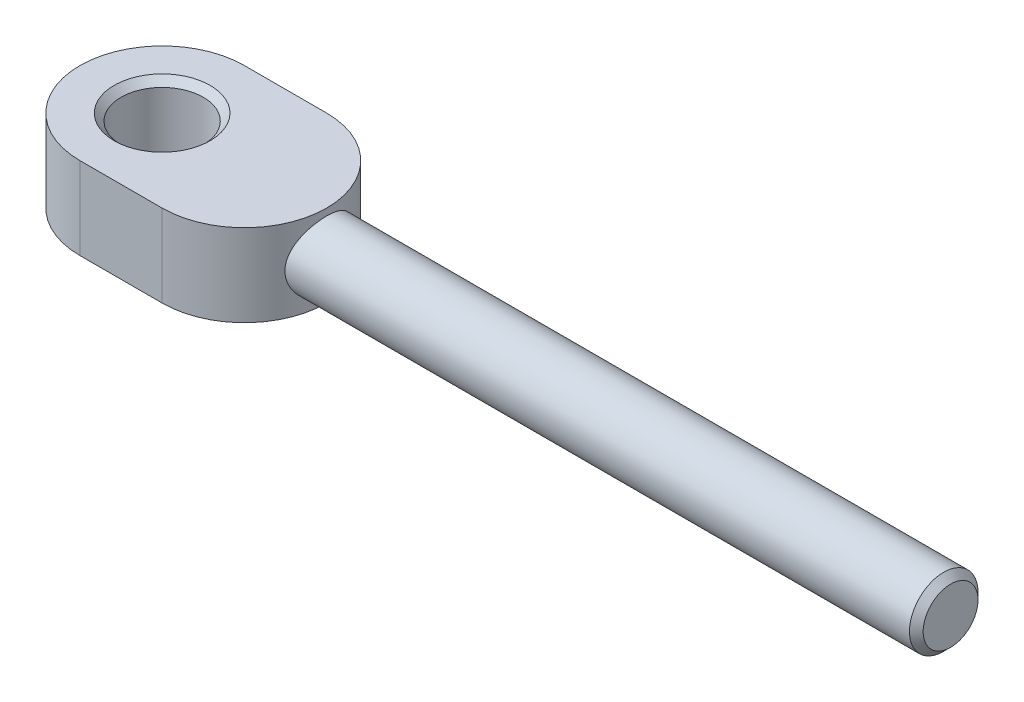
ISO-10303-21;
HEADER;
FILE_DESCRIPTION(('STEP AP214'),'2;1');
FILE_NAME('part.step','',(''),(''),'','','');
FILE_SCHEMA(('AUTOMOTIVE_DESIGN { 1 0 10303 214 1 1 1 1 }'));
ENDSEC;
DATA;
#1=APPLICATION_CONTEXT('core data for automotive mechanical design processes');
#2=APPLICATION_PROTOCOL_DEFINITION('international standard','automotive_design',2000,#1);
#3=PRODUCT_CONTEXT('',#1,'mechanical');
#4=PRODUCT('Part','Part','',(#3));
#5=PRODUCT_RELATED_PRODUCT_CATEGORY('part','',(#4));
#6=PRODUCT_DEFINITION_FORMATION('','',#4);
#7=PRODUCT_DEFINITION_CONTEXT('part definition',#1,'design');
#8=PRODUCT_DEFINITION('design','',#6,#7);
#9=PRODUCT_DEFINITION_SHAPE('','',#8);
#10=(LENGTH_UNIT() NAMED_UNIT(*) SI_UNIT(.MILLI.,.METRE.));
#11=(NAMED_UNIT(*) PLANE_ANGLE_UNIT() SI_UNIT($,.RADIAN.));
#12=(NAMED_UNIT(*) SI_UNIT($,.STERADIAN.) SOLID_ANGLE_UNIT());
#13=UNCERTAINTY_MEASURE_WITH_UNIT(LENGTH_MEASURE(1.E-05),#10,'distance_accuracy_value','');
#14=(GEOMETRIC_REPRESENTATION_CONTEXT(3) GLOBAL_UNCERTAINTY_ASSIGNED_CONTEXT((#13)) GLOBAL_UNIT_ASSIGNED_CONTEXT((#10,
#11,#12)) REPRESENTATION_CONTEXT('',''));
#15=CARTESIAN_POINT('',(0.,0.,0.));
#16=DIRECTION('',(0.,0.,1.));
#17=DIRECTION('',(1.,0.,0.));
#18=AXIS2_PLACEMENT_3D('',#15,#16,#17);
#19=CARTESIAN_POINT('',(0.,12.,0.));
#20=DIRECTION('',(0.,1.,0.));
#21=DIRECTION('',(0.,0.,1.));
#22=AXIS2_PLACEMENT_3D('',#19,#20,#21);
#23=PLANE('',#22);
#24=CARTESIAN_POINT('',(0.,12.,0.));
#25=DIRECTION('',(0.,1.,0.));
#26=DIRECTION('',(0.,0.,1.));
#27=AXIS2_PLACEMENT_3D('',#24,#25,#26);
#28=CIRCLE('',#27,6.99999999999999);
#29=CARTESIAN_POINT('',(0.,12.,6.99999999999999));
#30=VERTEX_POINT('',#29);
#31=EDGE_CURVE('E142',#30,#30,#28,.F.);
#32=ORIENTED_EDGE('',*,*,#31,.T.);
#33=EDGE_LOOP('',(#32));
#34=FACE_BOUND('',#33,.T.);
#35=CARTESIAN_POINT('',(0.,12.,0.));
#36=DIRECTION('',(0.,1.,0.));
#37=DIRECTION('',(0.,0.,1.));
#38=AXIS2_PLACEMENT_3D('',#35,#36,#37);
#39=CIRCLE('',#38,12.);
#40=CARTESIAN_POINT('',(0.,12.,-12.));
#41=VERTEX_POINT('',#40);
#42=CARTESIAN_POINT('',(0.,12.,12.));
#43=VERTEX_POINT('',#42);
#44=EDGE_CURVE('E94',#41,#43,#39,.T.);
#45=ORIENTED_EDGE('',*,*,#44,.T.);
#46=DIRECTION('',(1.,0.,0.));
#47=VECTOR('',#46,1.);
#48=CARTESIAN_POINT('',(0.,12.,12.));
#49=LINE('',#48,#47);
#50=CARTESIAN_POINT('',(12.,12.,12.));
#51=VERTEX_POINT('',#50);
#52=EDGE_CURVE('E90',#43,#51,#49,.T.);
#53=ORIENTED_EDGE('',*,*,#52,.T.);
#54=CARTESIAN_POINT('',(12.,12.,0.));
#55=DIRECTION('',(0.,1.,0.));
#56=DIRECTION('',(0.,0.,1.));
#57=AXIS2_PLACEMENT_3D('',#54,#55,#56);
#58=CIRCLE('',#57,12.);
#59=CARTESIAN_POINT('',(12.,12.,-12.));
#60=VERTEX_POINT('',#59);
#61=EDGE_CURVE('E92',#51,#60,#58,.T.);
#62=ORIENTED_EDGE('',*,*,#61,.T.);
#63=DIRECTION('',(-1.,0.,0.));
#64=VECTOR('',#63,1.);
#65=CARTESIAN_POINT('',(0.,12.,-12.));
#66=LINE('',#65,#64);
#67=EDGE_CURVE('E59',#60,#41,#66,.T.);
#68=ORIENTED_EDGE('',*,*,#67,.T.);
#69=EDGE_LOOP('',(#45,#53,#62,#68));
#70=FACE_BOUND('',#69,.T.);
#71=ADVANCED_FACE('F41',(#34,#70),#23,.T.);
#72=CARTESIAN_POINT('',(0.,0.,0.));
#73=DIRECTION('',(0.,1.,0.));
#74=DIRECTION('',(0.,0.,1.));
#75=AXIS2_PLACEMENT_3D('',#72,#73,#74);
#76=PLANE('',#75);
#77=CARTESIAN_POINT('',(0.,0.,0.));
#78=DIRECTION('',(0.,1.,0.));
#79=DIRECTION('',(0.,0.,1.));
#80=AXIS2_PLACEMENT_3D('',#77,#78,#79);
#81=CIRCLE('',#80,7.);
#82=CARTESIAN_POINT('',(0.,0.,7.));
#83=VERTEX_POINT('',#82);
#84=EDGE_CURVE('E130',#83,#83,#81,.T.);
#85=ORIENTED_EDGE('',*,*,#84,.T.);
#86=EDGE_LOOP('',(#85));
#87=FACE_BOUND('',#86,.T.);
#88=CARTESIAN_POINT('',(0.,0.,0.));
#89=DIRECTION('',(0.,1.,0.));
#90=DIRECTION('',(0.,0.,1.));
#91=AXIS2_PLACEMENT_3D('',#88,#89,#90);
#92=CIRCLE('',#91,12.);
#93=CARTESIAN_POINT('',(0.,0.,-12.));
#94=VERTEX_POINT('',#93);
#95=CARTESIAN_POINT('',(0.,0.,12.));
#96=VERTEX_POINT('',#95);
#97=EDGE_CURVE('E113',#94,#96,#92,.T.);
#98=ORIENTED_EDGE('',*,*,#97,.F.);
#99=DIRECTION('',(-1.,0.,0.));
#100=VECTOR('',#99,1.);
#101=CARTESIAN_POINT('',(0.,0.,-12.));
#102=LINE('',#101,#100);
#103=CARTESIAN_POINT('',(12.,0.,-12.));
#104=VERTEX_POINT('',#103);
#105=EDGE_CURVE('E82',#104,#94,#102,.T.);
#106=ORIENTED_EDGE('',*,*,#105,.F.);
#107=CARTESIAN_POINT('',(12.,0.,0.));
#108=DIRECTION('',(0.,1.,0.));
#109=DIRECTION('',(0.,0.,1.));
#110=AXIS2_PLACEMENT_3D('',#107,#108,#109);
#111=CIRCLE('',#110,12.);
#112=CARTESIAN_POINT('',(12.,0.,12.));
#113=VERTEX_POINT('',#112);
#114=EDGE_CURVE('E76',#113,#104,#111,.T.);
#115=ORIENTED_EDGE('',*,*,#114,.F.);
#116=DIRECTION('',(1.,0.,0.));
#117=VECTOR('',#116,1.);
#118=CARTESIAN_POINT('',(0.,0.,12.));
#119=LINE('',#118,#117);
#120=EDGE_CURVE('E100',#96,#113,#119,.T.);
#121=ORIENTED_EDGE('',*,*,#120,.F.);
#122=EDGE_LOOP('',(#98,#106,#115,#121));
#123=FACE_BOUND('',#122,.T.);
#124=ADVANCED_FACE('F172',(#87,#123),#76,.F.);
#125=CARTESIAN_POINT('',(0.,12.,0.));
#126=DIRECTION('',(0.,-1.,0.));
#127=DIRECTION('',(0.,0.,-1.));
#128=AXIS2_PLACEMENT_3D('',#125,#126,#127);
#129=CYLINDRICAL_SURFACE('',#128,12.);
#130=ORIENTED_EDGE('',*,*,#97,.T.);
#131=DIRECTION('',(0.,-1.,0.));
#132=VECTOR('',#131,1.);
#133=CARTESIAN_POINT('',(0.,12.,12.));
#134=LINE('',#133,#132);
#135=EDGE_CURVE('E102',#43,#96,#134,.T.);
#136=ORIENTED_EDGE('',*,*,#135,.F.);
#137=ORIENTED_EDGE('',*,*,#44,.F.);
#138=DIRECTION('',(0.,-1.,0.));
#139=VECTOR('',#138,1.);
#140=CARTESIAN_POINT('',(0.,12.,-12.));
#141=LINE('',#140,#139);
#142=EDGE_CURVE('E109',#41,#94,#141,.T.);
#143=ORIENTED_EDGE('',*,*,#142,.T.);
#144=EDGE_LOOP('',(#130,#136,#137,#143));
#145=FACE_BOUND('',#144,.T.);
#146=ADVANCED_FACE('F175',(#145),#129,.T.);
#147=CARTESIAN_POINT('',(0.,12.,12.));
#148=DIRECTION('',(0.,0.,-1.));
#149=DIRECTION('',(-1.,0.,0.));
#150=AXIS2_PLACEMENT_3D('',#147,#148,#149);
#151=PLANE('',#150);
#152=ORIENTED_EDGE('',*,*,#120,.T.);
#153=DIRECTION('',(0.,-1.,0.));
#154=VECTOR('',#153,1.);
#155=CARTESIAN_POINT('',(12.,12.,12.));
#156=LINE('',#155,#154);
#157=EDGE_CURVE('E98',#51,#113,#156,.T.);
#158=ORIENTED_EDGE('',*,*,#157,.F.);
#159=ORIENTED_EDGE('',*,*,#52,.F.);
#160=ORIENTED_EDGE('',*,*,#135,.T.);
#161=EDGE_LOOP('',(#152,#158,#159,#160));
#162=FACE_BOUND('',#161,.T.);
#163=ADVANCED_FACE('F99',(#162),#151,.F.);
#164=CARTESIAN_POINT('',(12.,12.,0.));
#165=DIRECTION('',(0.,-1.,0.));
#166=DIRECTION('',(0.,0.,-1.));
#167=AXIS2_PLACEMENT_3D('',#164,#165,#166);
#168=CYLINDRICAL_SURFACE('',#167,12.);
#169=CARTESIAN_POINT('',(22.9087121146357,6.,-5.));
#170=CARTESIAN_POINT('',(22.9087130764532,5.86659865791437,-4.99999907346954));
#171=CARTESIAN_POINT('',(22.9111675954631,5.73314990943804,-4.99465346647854));
#172=CARTESIAN_POINT('',(22.9209052166454,5.46722312061178,-4.97332510133915));
#173=CARTESIAN_POINT('',(22.9281914710262,5.33474577108317,-4.95733539899108));
#174=CARTESIAN_POINT('',(22.94736464011,5.07153052654401,-4.91485001389297));
#175=CARTESIAN_POINT('',(22.9592613290627,4.94079694159147,-4.88833200790255));
#176=CARTESIAN_POINT('',(22.9872633476551,4.68224168103286,-4.82506361967691));
#177=CARTESIAN_POINT('',(23.0033704480092,4.55442125522111,-4.7883089319155));
#178=CARTESIAN_POINT('',(23.0391992954798,4.30314636864751,-4.7051161177753));
#179=CARTESIAN_POINT('',(23.0589043317801,4.17967474799243,-4.65872262741865));
#180=CARTESIAN_POINT('',(23.1013893730745,3.93720574547302,-4.5565572335341));
#181=CARTESIAN_POINT('',(23.1241705351676,3.81821006889575,-4.5007817989946));
#182=CARTESIAN_POINT('',(23.1961478055544,3.46910117112067,-4.32007909456559));
#183=CARTESIAN_POINT('',(23.2490254866249,3.2465492257116,-4.18166963633182));
#184=CARTESIAN_POINT('',(23.3622340846149,2.81466232306502,-3.86388960131915));
#185=CARTESIAN_POINT('',(23.4228172047289,2.60678182765071,-3.68264836841194));
#186=CARTESIAN_POINT('',(23.5425773354484,2.2231870427433,-3.28805127368673));
#187=CARTESIAN_POINT('',(23.6017537962903,2.04748515540236,-3.07468308711391));
#188=CARTESIAN_POINT('',(23.6861172629685,1.80819662209914,-2.72939811902874));
#189=CARTESIAN_POINT('',(23.7140370116577,1.73114749631908,-2.60726265021164));
#190=CARTESIAN_POINT('',(23.7670757792015,1.58768565279853,-2.35633907958865));
#191=CARTESIAN_POINT('',(23.7921959593645,1.52126851970044,-2.22755376893512));
#192=CARTESIAN_POINT('',(23.838917440778,1.39966101478051,-1.96416180919325));
#193=CARTESIAN_POINT('',(23.8605184059307,1.34447171513237,-1.82955460564478));
#194=CARTESIAN_POINT('',(23.8995529267482,1.24590609628429,-1.55556138641083));
#195=CARTESIAN_POINT('',(23.9169885604685,1.20252388509814,-1.41617779348791));
#196=CARTESIAN_POINT('',(23.9463943774625,1.1299506587623,-1.14097065626753));
#197=CARTESIAN_POINT('',(23.9586002649643,1.10014259308929,-1.00533485679253));
#198=CARTESIAN_POINT('',(23.978450915234,1.05189217534323,-0.731783678022631));
#199=CARTESIAN_POINT('',(23.9860977087489,1.03344476279932,-0.593869341827158));
#200=CARTESIAN_POINT('',(23.9966178230295,1.00810936078691,-0.316820356986366));
#201=CARTESIAN_POINT('',(23.9994918028326,1.00121977539495,-0.177685879487621));
#202=CARTESIAN_POINT('',(24.0003846753354,0.999076680636109,0.100685666016497));
#203=CARTESIAN_POINT('',(23.9984037561412,1.0038227204402,0.239922729838139));
#204=CARTESIAN_POINT('',(23.9899136606251,1.0242480185652,0.508875497772577));
#205=CARTESIAN_POINT('',(23.9836886839462,1.03924123047607,0.638652954685693));
#206=CARTESIAN_POINT('',(23.9671679484583,1.07928451587147,0.89642573301948));
#207=CARTESIAN_POINT('',(23.9568708432383,1.10433791570475,1.02442045048903));
#208=CARTESIAN_POINT('',(23.9324642419976,1.16425258678566,1.27768058963447));
#209=CARTESIAN_POINT('',(23.9183560059372,1.19911061677834,1.40294689855866));
#210=CARTESIAN_POINT('',(23.8866740631288,1.27831323073566,1.65000960949552));
#211=CARTESIAN_POINT('',(23.8690990384662,1.32266142297195,1.77180467168387));
#212=CARTESIAN_POINT('',(23.8112061935099,1.47086825690074,2.13440608091059));
#213=CARTESIAN_POINT('',(23.7660875760496,1.58902348292157,2.36878813427704));
#214=CARTESIAN_POINT('',(23.6674248672799,1.85939740044734,2.8148876575074));
#215=CARTESIAN_POINT('',(23.6138778002992,2.01162813038025,3.02659707825227));
#216=CARTESIAN_POINT('',(23.4992708053806,2.35831515830031,3.4373466397403));
#217=CARTESIAN_POINT('',(23.4379473626343,2.55499149580639,3.6344418353681));
#218=CARTESIAN_POINT('',(23.317506835943,2.9788894489507,3.99374958281551));
#219=CARTESIAN_POINT('',(23.2583906106422,3.20612279680368,4.15594867394866));
#220=CARTESIAN_POINT('',(23.1754830102252,3.56976847109777,4.37204843185914));
#221=CARTESIAN_POINT('',(23.1484199498727,3.69704190960107,4.44042007897756));
#222=CARTESIAN_POINT('',(23.0975376088836,3.95754352725252,4.56609824374461));
#223=CARTESIAN_POINT('',(23.0737170007443,4.09076923960836,4.62340929378705));
#224=CARTESIAN_POINT('',(23.0301558587157,4.36223267911825,4.72639308965464));
#225=CARTESIAN_POINT('',(23.010413835582,4.50046855512521,4.77207008493292));
#226=CARTESIAN_POINT('',(22.9757324560172,4.78096035789103,4.85130620649788));
#227=CARTESIAN_POINT('',(22.9607926721103,4.92321592560632,4.88486641140439));
#228=CARTESIAN_POINT('',(22.9370969792104,5.20124231792369,4.93768074905133));
#229=CARTESIAN_POINT('',(22.9280027904062,5.33683517918124,4.95772169190295));
#230=CARTESIAN_POINT('',(22.9148523191373,5.60944791240115,4.9866073793505));
#231=CARTESIAN_POINT('',(22.9107956985943,5.74646768797884,4.99545287528973));
#232=CARTESIAN_POINT('',(22.9078699530068,6.02078605988454,5.00183821697948));
#233=CARTESIAN_POINT('',(22.9089993303948,6.1580845642777,4.9993813265346));
#234=CARTESIAN_POINT('',(22.9163998119757,6.43187112828671,4.98320111894242));
#235=CARTESIAN_POINT('',(22.9226707625354,6.56835921199565,4.96947813843228));
#236=CARTESIAN_POINT('',(22.939564595642,6.83071574253981,4.93217158492222));
#237=CARTESIAN_POINT('',(22.9498816230819,6.95670259071433,4.90927900797924));
#238=CARTESIAN_POINT('',(22.9744912995808,7.20619548163046,4.85401305684628));
#239=CARTESIAN_POINT('',(22.9887852266843,7.32970071315867,4.82163663468421));
#240=CARTESIAN_POINT('',(23.0370194337985,7.69526799217255,4.71071065616066));
#241=CARTESIAN_POINT('',(23.0763259662732,7.93258045461717,4.61833566351839));
#242=CARTESIAN_POINT('',(23.1668340116265,8.3985017812262,4.39509042810499));
#243=CARTESIAN_POINT('',(23.2184687772574,8.62631643122829,4.26275559713322));
#244=CARTESIAN_POINT('',(23.3271978594732,9.05761567004121,3.96481487774639));
#245=CARTESIAN_POINT('',(23.3842945333687,9.26108966760643,3.79919458936811));
#246=CARTESIAN_POINT('',(23.5031524298602,9.65522822272602,3.42333828888212));
#247=CARTESIAN_POINT('',(23.5649149877289,9.84350149729714,3.21056780271632));
#248=CARTESIAN_POINT('',(23.652539724218,10.0973129626824,2.86918502481984));
#249=CARTESIAN_POINT('',(23.6809270167356,10.1771898057794,2.75160882485037));
#250=CARTESIAN_POINT('',(23.7352796462331,10.3268524377314,2.50969002115846));
#251=CARTESIAN_POINT('',(23.761246025341,10.3966425757839,2.38535036573304));
#252=CARTESIAN_POINT('',(23.8101156015739,10.5257499838625,2.13027929692906));
#253=CARTESIAN_POINT('',(23.8330091330538,10.5850343870947,1.99952940315085));
#254=CARTESIAN_POINT('',(23.8749794540163,10.6922886558686,1.73293321082208));
#255=CARTESIAN_POINT('',(23.8940578848995,10.7402633888541,1.59708913398471));
#256=CARTESIAN_POINT('',(23.9278439649912,10.8244116037013,1.32129951276987));
#257=CARTESIAN_POINT('',(23.9425527871688,10.8605882528726,1.18135508018567));
#258=CARTESIAN_POINT('',(23.9671605398288,10.9207404594656,0.898454675987307));
#259=CARTESIAN_POINT('',(23.9770598307871,10.9447169313007,0.755498930910137));
#260=CARTESIAN_POINT('',(23.9912289923392,10.978935158097,0.477883420739099));
#261=CARTESIAN_POINT('',(23.9958449399558,10.9900221403332,0.343344870081025));
#262=CARTESIAN_POINT('',(24.0005316025811,11.0012784342622,0.0736837007935107));
#263=CARTESIAN_POINT('',(24.0006007901938,11.0014440771427,-0.0614390988588049));
#264=CARTESIAN_POINT('',(23.9961887486254,10.9908483610399,-0.33110622953467));
#265=CARTESIAN_POINT('',(23.9917099776235,10.9800929049289,-0.465650833622079));
#266=CARTESIAN_POINT('',(23.9783256851574,10.9477774444591,-0.733261310716006));
#267=CARTESIAN_POINT('',(23.9694185152718,10.9262134167075,-0.866326614198361));
#268=CARTESIAN_POINT('',(23.9478093264375,10.8734696562263,-1.12521434278972));
#269=CARTESIAN_POINT('',(23.9352551439933,10.8426632258164,-1.25112522777306));
#270=CARTESIAN_POINT('',(23.9065633482735,10.7715090739519,-1.49981842973105));
#271=CARTESIAN_POINT('',(23.8904244841412,10.7311580216289,-1.62259963790794));
#272=CARTESIAN_POINT('',(23.8371898373541,10.5963001094981,-1.98503132832704));
#273=CARTESIAN_POINT('',(23.7952573948446,10.4879448731626,-2.21898154506248));
#274=CARTESIAN_POINT('',(23.700229723716,10.2320286177314,-2.67613896894387));
#275=CARTESIAN_POINT('',(23.6467156543532,10.0829170609564,-2.8983828280104));
#276=CARTESIAN_POINT('',(23.5348651891756,9.751985006967,-3.31565850042872));
#277=CARTESIAN_POINT('',(23.4765270075164,9.57015236713049,-3.51068016389786));
#278=CARTESIAN_POINT('',(23.3565857314856,9.16417617105096,-3.88182487095485));
#279=CARTESIAN_POINT('',(23.2950305954797,8.93799545156909,-4.05575892114007));
#280=CARTESIAN_POINT('',(23.2086213285894,8.57814226412511,-4.28644220599616));
#281=CARTESIAN_POINT('',(23.1807840573516,8.45464555962541,-4.3583492231784));
#282=CARTESIAN_POINT('',(23.1279493027585,8.2014884755108,-4.49153302890032));
#283=CARTESIAN_POINT('',(23.1029505274209,8.07183093851671,-4.5528146604858));
#284=CARTESIAN_POINT('',(23.0567342904296,7.80781229372493,-4.66392927630358));
#285=CARTESIAN_POINT('',(23.0354990935144,7.67347702103786,-4.7138162956702));
#286=CARTESIAN_POINT('',(22.9974167298328,7.40050731303406,-4.80199267289388));
#287=CARTESIAN_POINT('',(22.9805674126509,7.2618750220188,-4.84028771585243));
#288=CARTESIAN_POINT('',(22.9519122752477,6.98170813607974,-4.90477948429217));
#289=CARTESIAN_POINT('',(22.9400931451405,6.84018225203986,-4.93100815251904));
#290=CARTESIAN_POINT('',(22.9219030893155,6.55512394637969,-4.9711694184283));
#291=CARTESIAN_POINT('',(22.9155279262954,6.41159317386851,-4.98511157956285));
#292=CARTESIAN_POINT('',(22.9109028487845,6.2231481561255,-4.99521783051923));
#293=CARTESIAN_POINT('',(22.9100818615663,6.17854324168516,-4.99701063605637));
#294=CARTESIAN_POINT('',(22.9089863310182,6.08929398863914,-4.99940188134453));
#295=CARTESIAN_POINT('',(22.9087117927138,6.04464964967469,-5.00000031011128));
#296=CARTESIAN_POINT('',(22.9087121146357,6.,-5.));
#297=B_SPLINE_CURVE_WITH_KNOTS('',3,(#169,#170,#171,#172,#173,#174,#175,#176,#177,#178,#179,
#180,#181,#182,#183,#184,#185,#186,#187,#188,#189,#190,#191,#192,#193,#194,#195,#196,#197,#198,
#199,#200,#201,#202,#203,#204,#205,#206,#207,#208,#209,#210,#211,#212,#213,#214,#215,#216,#217,
#218,#219,#220,#221,#222,#223,#224,#225,#226,#227,#228,#229,#230,#231,#232,#233,#234,#235,#236,
#237,#238,#239,#240,#241,#242,#243,#244,#245,#246,#247,#248,#249,#250,#251,#252,#253,#254,#255,
#256,#257,#258,#259,#260,#261,#262,#263,#264,#265,#266,#267,#268,#269,#270,#271,#272,#273,#274,
#275,#276,#277,#278,#279,#280,#281,#282,#283,#284,#285,#286,#287,#288,#289,#290,#291,#292,#293,
#294,#295,#296),.UNSPECIFIED.,.T.,.F.,(4,2,2,2,2,2,2,2,2,2,2,2,2,2,2,2,2,2,2,2,2,2,2,2,2,2,2,2,
2,2,2,2,2,2,2,2,2,2,2,2,2,2,2,2,2,2,2,2,2,2,2,2,2,2,2,2,2,2,2,2,2,2,2,4),(0.,0.400157436000171,
0.800576190593219,1.201848529411,1.60328989804515,2.00291210380929,2.40268505027807,
3.20123019587003,4.04483609889578,4.88876646006605,5.32954710296567,5.77014421661471,
6.2107833842476,6.6512022587805,7.0688822540997,7.48637606389429,7.90381222072139,
8.32123220399826,8.71313663078892,9.10517074557807,9.49707541213125,9.88912935105431,
10.6843842085816,11.4799204638783,12.3315328967583,13.1834732406336,13.6239634696043,
14.064272810136,14.5044210919574,14.9445301827247,15.3560893757574,15.7676209469674,
16.1790336871391,16.5904341345125,16.9753736617613,17.3604370390525,18.129966872946,
18.9320860691316,19.7345530282234,20.6023475058253,21.0367677320598,21.4710000820441,
21.9065678086378,22.3419477324182,22.7772106778488,23.2124409951531,23.6171514188591,
24.0219977964934,24.4266254703975,24.8314038752673,25.2216396203095,25.6120117507033,
26.3921129345308,27.2074696624053,28.0231295912,28.8942922255873,29.3306260081945,
29.7667603842384,30.2007814897643,30.6345893903394,31.0672421881929,31.4995579237516,
31.6334900472163,31.7674234024044),.UNSPECIFIED.);
#298=CARTESIAN_POINT('',(22.9087121146357,6.,-5.));
#299=VERTEX_POINT('',#298);
#300=EDGE_CURVE('E117',#299,#299,#297,.T.);
#301=ORIENTED_EDGE('',*,*,#300,.T.);
#302=EDGE_LOOP('',(#301));
#303=FACE_BOUND('',#302,.T.);
#304=ORIENTED_EDGE('',*,*,#114,.T.);
#305=DIRECTION('',(0.,-1.,0.));
#306=VECTOR('',#305,1.);
#307=CARTESIAN_POINT('',(12.,12.,-12.));
#308=LINE('',#307,#306);
#309=EDGE_CURVE('E103',#60,#104,#308,.T.);
#310=ORIENTED_EDGE('',*,*,#309,.F.);
#311=ORIENTED_EDGE('',*,*,#61,.F.);
#312=ORIENTED_EDGE('',*,*,#157,.T.);
#313=EDGE_LOOP('',(#304,#310,#311,#312));
#314=FACE_BOUND('',#313,.T.);
#315=ADVANCED_FACE('F105',(#303,#314),#168,.T.);
#316=CARTESIAN_POINT('',(0.,12.,-12.));
#317=DIRECTION('',(0.,0.,1.));
#318=DIRECTION('',(1.,0.,0.));
#319=AXIS2_PLACEMENT_3D('',#316,#317,#318);
#320=PLANE('',#319);
#321=ORIENTED_EDGE('',*,*,#105,.T.);
#322=ORIENTED_EDGE('',*,*,#142,.F.);
#323=ORIENTED_EDGE('',*,*,#67,.F.);
#324=ORIENTED_EDGE('',*,*,#309,.T.);
#325=EDGE_LOOP('',(#321,#322,#323,#324));
#326=FACE_BOUND('',#325,.T.);
#327=ADVANCED_FACE('F168',(#326),#320,.F.);
#328=CARTESIAN_POINT('',(0.,12.,0.));
#329=DIRECTION('',(0.,-1.,0.));
#330=DIRECTION('',(0.,0.,-1.));
#331=AXIS2_PLACEMENT_3D('',#328,#329,#330);
#332=CYLINDRICAL_SURFACE('',#331,6.);
#333=CARTESIAN_POINT('',(0.,1.,0.));
#334=DIRECTION('',(0.,1.,0.));
#335=DIRECTION('',(0.,0.,1.));
#336=AXIS2_PLACEMENT_3D('',#333,#334,#335);
#337=CIRCLE('',#336,6.);
#338=CARTESIAN_POINT('',(0.,1.,6.));
#339=VERTEX_POINT('',#338);
#340=EDGE_CURVE('E138',#339,#339,#337,.F.);
#341=ORIENTED_EDGE('',*,*,#340,.T.);
#342=EDGE_LOOP('',(#341));
#343=FACE_BOUND('',#342,.T.);
#344=CARTESIAN_POINT('',(0.,11.,0.));
#345=DIRECTION('',(0.,1.,0.));
#346=DIRECTION('',(0.,0.,1.));
#347=AXIS2_PLACEMENT_3D('',#344,#345,#346);
#348=CIRCLE('',#347,6.);
#349=CARTESIAN_POINT('',(0.,11.,6.));
#350=VERTEX_POINT('',#349);
#351=EDGE_CURVE('E134',#350,#350,#348,.T.);
#352=ORIENTED_EDGE('',*,*,#351,.T.);
#353=EDGE_LOOP('',(#352));
#354=FACE_BOUND('',#353,.T.);
#355=ADVANCED_FACE('F164',(#343,#354),#332,.F.);
#356=CARTESIAN_POINT('',(0.,0.,0.));
#357=DIRECTION('',(0.,-1.,0.));
#358=DIRECTION('',(0.,0.,-1.));
#359=AXIS2_PLACEMENT_3D('',#356,#357,#358);
#360=CONICAL_SURFACE('',#359,7.,0.785398163397447);
#361=ORIENTED_EDGE('',*,*,#340,.F.);
#362=EDGE_LOOP('',(#361));
#363=FACE_BOUND('',#362,.T.);
#364=ORIENTED_EDGE('',*,*,#84,.F.);
#365=EDGE_LOOP('',(#364));
#366=FACE_BOUND('',#365,.T.);
#367=ADVANCED_FACE('F167',(#363,#366),#360,.F.);
#368=CARTESIAN_POINT('',(0.,11.,0.));
#369=DIRECTION('',(0.,1.,0.));
#370=DIRECTION('',(0.,0.,1.));
#371=AXIS2_PLACEMENT_3D('',#368,#369,#370);
#372=CONICAL_SURFACE('',#371,6.,0.785398163397448);
#373=ORIENTED_EDGE('',*,*,#31,.F.);
#374=EDGE_LOOP('',(#373));
#375=FACE_BOUND('',#374,.T.);
#376=ORIENTED_EDGE('',*,*,#351,.F.);
#377=EDGE_LOOP('',(#376));
#378=FACE_BOUND('',#377,.T.);
#379=ADVANCED_FACE('F162',(#375,#378),#372,.F.);
#380=CARTESIAN_POINT('',(21.,6.,0.));
#381=DIRECTION('',(1.,0.,0.));
#382=DIRECTION('',(0.,0.,-1.));
#383=AXIS2_PLACEMENT_3D('',#380,#381,#382);
#384=CYLINDRICAL_SURFACE('',#383,5.);
#385=CARTESIAN_POINT('',(114.,6.,0.));
#386=DIRECTION('',(1.,0.,0.));
#387=DIRECTION('',(0.,0.,-1.));
#388=AXIS2_PLACEMENT_3D('',#385,#386,#387);
#389=CIRCLE('',#388,5.);
#390=CARTESIAN_POINT('',(114.,6.,-5.));
#391=VERTEX_POINT('',#390);
#392=EDGE_CURVE('E11',#391,#391,#389,.F.);
#393=ORIENTED_EDGE('',*,*,#392,.T.);
#394=EDGE_LOOP('',(#393));
#395=FACE_BOUND('',#394,.T.);
#396=ORIENTED_EDGE('',*,*,#300,.F.);
#397=EDGE_LOOP('',(#396));
#398=FACE_BOUND('',#397,.T.);
#399=ADVANCED_FACE('F156',(#395,#398),#384,.T.);
#400=CARTESIAN_POINT('',(115.,0.,0.));
#401=DIRECTION('',(1.,0.,0.));
#402=DIRECTION('',(0.,0.,-1.));
#403=AXIS2_PLACEMENT_3D('',#400,#401,#402);
#404=PLANE('',#403);
#405=CARTESIAN_POINT('',(115.,6.,0.));
#406=DIRECTION('',(1.,0.,0.));
#407=DIRECTION('',(0.,0.,-1.));
#408=AXIS2_PLACEMENT_3D('',#405,#406,#407);
#409=CIRCLE('',#408,3.99999999999998);
#410=CARTESIAN_POINT('',(115.,6.,-3.99999999999998));
#411=VERTEX_POINT('',#410);
#412=EDGE_CURVE('E51',#411,#411,#409,.T.);
#413=ORIENTED_EDGE('',*,*,#412,.T.);
#414=EDGE_LOOP('',(#413));
#415=FACE_BOUND('',#414,.T.);
#416=ADVANCED_FACE('F161',(#415),#404,.T.);
#417=CARTESIAN_POINT('',(115.,6.,0.));
#418=DIRECTION('',(-1.,0.,0.));
#419=DIRECTION('',(0.,0.,1.));
#420=AXIS2_PLACEMENT_3D('',#417,#418,#419);
#421=CONICAL_SURFACE('',#420,3.99999999999998,0.785398163397446);
#422=ORIENTED_EDGE('',*,*,#392,.F.);
#423=EDGE_LOOP('',(#422));
#424=FACE_BOUND('',#423,.T.);
#425=ORIENTED_EDGE('',*,*,#412,.F.);
#426=EDGE_LOOP('',(#425));
#427=FACE_BOUND('',#426,.T.);
#428=ADVANCED_FACE('F43',(#424,#427),#421,.T.);
#429=CLOSED_SHELL('',(#71,#124,#146,#163,#315,#327,#355,#367,#379,#399,#416,#428));
#430=MANIFOLD_SOLID_BREP('B2',#429);
#431=ADVANCED_BREP_SHAPE_REPRESENTATION('',(#18,#430),#14);
#432=SHAPE_DEFINITION_REPRESENTATION(#9,#431);
ENDSEC;
END-ISO-10303-21;
